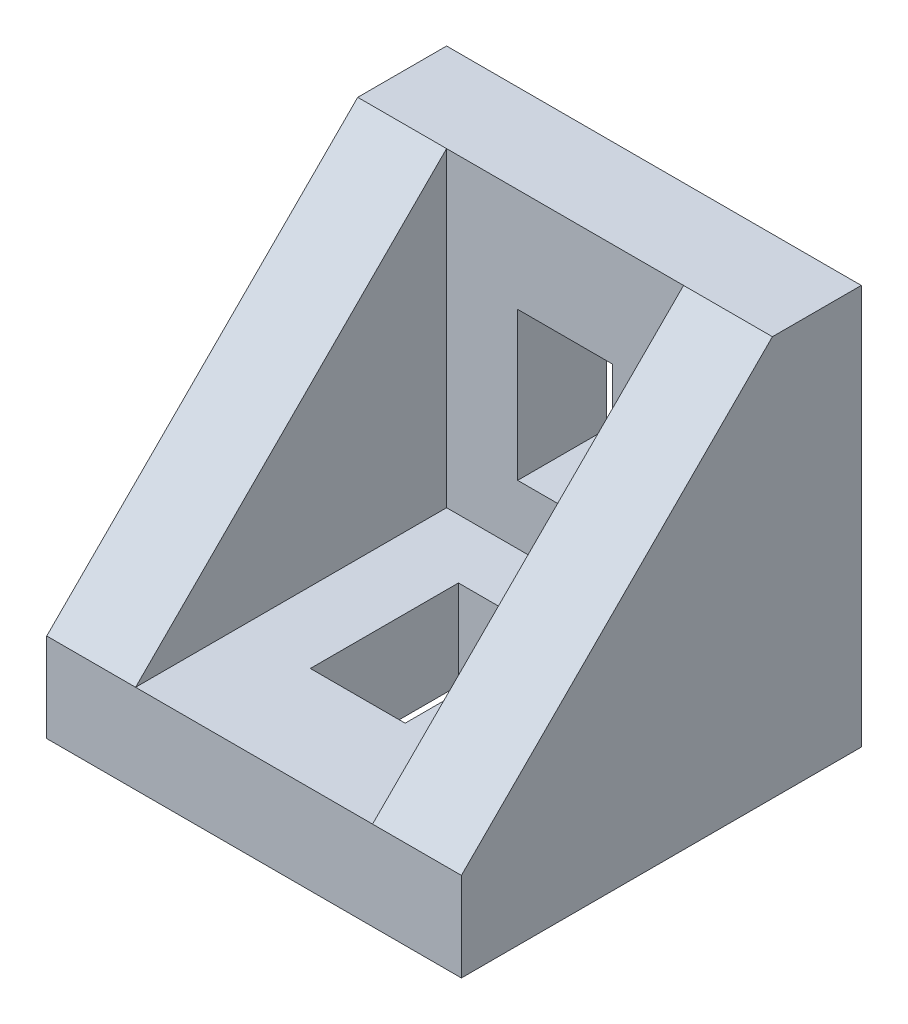
ISO-10303-21;
HEADER;
FILE_DESCRIPTION(('STEP AP214'),'2;1');
FILE_NAME('part.step','',(''),(''),'','','');
FILE_SCHEMA(('AUTOMOTIVE_DESIGN { 1 0 10303 214 1 1 1 1 }'));
ENDSEC;
DATA;
#1=APPLICATION_CONTEXT('core data for automotive mechanical design processes');
#2=APPLICATION_PROTOCOL_DEFINITION('international standard','automotive_design',2000,#1);
#3=PRODUCT_CONTEXT('',#1,'mechanical');
#4=PRODUCT('Part','Part','',(#3));
#5=PRODUCT_RELATED_PRODUCT_CATEGORY('part','',(#4));
#6=PRODUCT_DEFINITION_FORMATION('','',#4);
#7=PRODUCT_DEFINITION_CONTEXT('part definition',#1,'design');
#8=PRODUCT_DEFINITION('design','',#6,#7);
#9=PRODUCT_DEFINITION_SHAPE('','',#8);
#10=(LENGTH_UNIT() NAMED_UNIT(*) SI_UNIT(.MILLI.,.METRE.));
#11=(NAMED_UNIT(*) PLANE_ANGLE_UNIT() SI_UNIT($,.RADIAN.));
#12=(NAMED_UNIT(*) SI_UNIT($,.STERADIAN.) SOLID_ANGLE_UNIT());
#13=UNCERTAINTY_MEASURE_WITH_UNIT(LENGTH_MEASURE(1.E-05),#10,'distance_accuracy_value','');
#14=(GEOMETRIC_REPRESENTATION_CONTEXT(3) GLOBAL_UNCERTAINTY_ASSIGNED_CONTEXT((#13)) GLOBAL_UNIT_ASSIGNED_CONTEXT((#10,
#11,#12)) REPRESENTATION_CONTEXT('',''));
#15=CARTESIAN_POINT('',(0.,0.,0.));
#16=DIRECTION('',(0.,0.,1.));
#17=DIRECTION('',(1.,0.,0.));
#18=AXIS2_PLACEMENT_3D('',#15,#16,#17);
#19=CARTESIAN_POINT('',(28.,3.,3.));
#20=DIRECTION('',(0.,-0.707106781186547,-0.707106781186547));
#21=DIRECTION('',(0.,0.707106781186548,-0.707106781186548));
#22=AXIS2_PLACEMENT_3D('',#19,#20,#21);
#23=PLANE('',#22);
#24=DIRECTION('',(0.,-0.707106781186548,0.707106781186548));
#25=VECTOR('',#24,1.);
#26=CARTESIAN_POINT('',(6.,3.,3.));
#27=LINE('',#26,#25);
#28=CARTESIAN_POINT('',(6.,27.,-21.));
#29=VERTEX_POINT('',#28);
#30=CARTESIAN_POINT('',(6.,5.99999999999999,0.));
#31=VERTEX_POINT('',#30);
#32=EDGE_CURVE('E253',#29,#31,#27,.T.);
#33=ORIENTED_EDGE('',*,*,#32,.F.);
#34=DIRECTION('',(-1.,0.,0.));
#35=VECTOR('',#34,1.);
#36=CARTESIAN_POINT('',(28.,27.,-21.));
#37=LINE('',#36,#35);
#38=CARTESIAN_POINT('',(0.,27.,-21.));
#39=VERTEX_POINT('',#38);
#40=EDGE_CURVE('E58',#29,#39,#37,.T.);
#41=ORIENTED_EDGE('',*,*,#40,.T.);
#42=DIRECTION('',(0.,-0.707106781186548,0.707106781186548));
#43=VECTOR('',#42,1.);
#44=CARTESIAN_POINT('',(0.,3.,3.));
#45=LINE('',#44,#43);
#46=CARTESIAN_POINT('',(0.,5.99999999999999,0.));
#47=VERTEX_POINT('',#46);
#48=EDGE_CURVE('E308',#39,#47,#45,.T.);
#49=ORIENTED_EDGE('',*,*,#48,.T.);
#50=DIRECTION('',(-1.,0.,0.));
#51=VECTOR('',#50,1.);
#52=CARTESIAN_POINT('',(28.,5.99999999999999,0.));
#53=LINE('',#52,#51);
#54=EDGE_CURVE('E330',#31,#47,#53,.T.);
#55=ORIENTED_EDGE('',*,*,#54,.F.);
#56=EDGE_LOOP('',(#33,#41,#49,#55));
#57=FACE_BOUND('',#56,.T.);
#58=ADVANCED_FACE('F49',(#57),#23,.F.);
#59=CARTESIAN_POINT('',(28.,27.,0.));
#60=DIRECTION('',(0.,-1.,0.));
#61=DIRECTION('',(0.,0.,-1.));
#62=AXIS2_PLACEMENT_3D('',#59,#60,#61);
#63=PLANE('',#62);
#64=DIRECTION('',(0.,0.,1.));
#65=VECTOR('',#64,1.);
#66=CARTESIAN_POINT('',(0.,27.,0.));
#67=LINE('',#66,#65);
#68=CARTESIAN_POINT('',(0.,27.,-27.));
#69=VERTEX_POINT('',#68);
#70=EDGE_CURVE('E258',#69,#39,#67,.T.);
#71=ORIENTED_EDGE('',*,*,#70,.T.);
#72=ORIENTED_EDGE('',*,*,#40,.F.);
#73=DIRECTION('',(-1.,0.,0.));
#74=VECTOR('',#73,1.);
#75=CARTESIAN_POINT('',(28.,27.,-21.));
#76=LINE('',#75,#74);
#77=CARTESIAN_POINT('',(22.,27.,-21.));
#78=VERTEX_POINT('',#77);
#79=EDGE_CURVE('E254',#78,#29,#76,.T.);
#80=ORIENTED_EDGE('',*,*,#79,.F.);
#81=CARTESIAN_POINT('',(28.,27.,-21.));
#82=VERTEX_POINT('',#81);
#83=EDGE_CURVE('E11',#82,#78,#37,.T.);
#84=ORIENTED_EDGE('',*,*,#83,.F.);
#85=DIRECTION('',(0.,0.,1.));
#86=VECTOR('',#85,1.);
#87=CARTESIAN_POINT('',(28.,27.,0.));
#88=LINE('',#87,#86);
#89=CARTESIAN_POINT('',(28.,27.,-27.));
#90=VERTEX_POINT('',#89);
#91=EDGE_CURVE('E287',#90,#82,#88,.T.);
#92=ORIENTED_EDGE('',*,*,#91,.F.);
#93=DIRECTION('',(-1.,0.,0.));
#94=VECTOR('',#93,1.);
#95=CARTESIAN_POINT('',(28.,27.,-27.));
#96=LINE('',#95,#94);
#97=EDGE_CURVE('E304',#90,#69,#96,.T.);
#98=ORIENTED_EDGE('',*,*,#97,.T.);
#99=EDGE_LOOP('',(#71,#72,#80,#84,#92,#98));
#100=FACE_BOUND('',#99,.T.);
#101=ADVANCED_FACE('F51',(#100),#63,.F.);
#102=ORIENTED_EDGE('',*,*,#83,.T.);
#103=DIRECTION('',(0.,-0.707106781186548,0.707106781186548));
#104=VECTOR('',#103,1.);
#105=CARTESIAN_POINT('',(22.,3.,3.));
#106=LINE('',#105,#104);
#107=CARTESIAN_POINT('',(22.,5.99999999999999,0.));
#108=VERTEX_POINT('',#107);
#109=EDGE_CURVE('E272',#78,#108,#106,.T.);
#110=ORIENTED_EDGE('',*,*,#109,.T.);
#111=CARTESIAN_POINT('',(28.,5.99999999999999,0.));
#112=VERTEX_POINT('',#111);
#113=EDGE_CURVE('E331',#112,#108,#53,.T.);
#114=ORIENTED_EDGE('',*,*,#113,.F.);
#115=DIRECTION('',(0.,-0.707106781186548,0.707106781186548));
#116=VECTOR('',#115,1.);
#117=CARTESIAN_POINT('',(28.,3.,3.));
#118=LINE('',#117,#116);
#119=EDGE_CURVE('E291',#82,#112,#118,.T.);
#120=ORIENTED_EDGE('',*,*,#119,.F.);
#121=EDGE_LOOP('',(#102,#110,#114,#120));
#122=FACE_BOUND('',#121,.T.);
#123=ADVANCED_FACE('F364',(#122),#23,.F.);
#124=CARTESIAN_POINT('',(28.,0.,0.));
#125=DIRECTION('',(0.,0.,-1.));
#126=DIRECTION('',(-1.,0.,0.));
#127=AXIS2_PLACEMENT_3D('',#124,#125,#126);
#128=PLANE('',#127);
#129=DIRECTION('',(0.,-1.,0.));
#130=VECTOR('',#129,1.);
#131=CARTESIAN_POINT('',(0.,0.,0.));
#132=LINE('',#131,#130);
#133=CARTESIAN_POINT('',(0.,0.,0.));
#134=VERTEX_POINT('',#133);
#135=EDGE_CURVE('E312',#47,#134,#132,.T.);
#136=ORIENTED_EDGE('',*,*,#135,.T.);
#137=DIRECTION('',(-1.,0.,0.));
#138=VECTOR('',#137,1.);
#139=CARTESIAN_POINT('',(28.,0.,0.));
#140=LINE('',#139,#138);
#141=CARTESIAN_POINT('',(28.,0.,0.));
#142=VERTEX_POINT('',#141);
#143=EDGE_CURVE('E327',#142,#134,#140,.T.);
#144=ORIENTED_EDGE('',*,*,#143,.F.);
#145=DIRECTION('',(0.,-1.,0.));
#146=VECTOR('',#145,1.);
#147=CARTESIAN_POINT('',(28.,0.,0.));
#148=LINE('',#147,#146);
#149=EDGE_CURVE('E295',#112,#142,#148,.T.);
#150=ORIENTED_EDGE('',*,*,#149,.F.);
#151=ORIENTED_EDGE('',*,*,#113,.T.);
#152=DIRECTION('',(-1.,0.,0.));
#153=VECTOR('',#152,1.);
#154=CARTESIAN_POINT('',(28.,6.,0.));
#155=LINE('',#154,#153);
#156=EDGE_CURVE('E259',#108,#31,#155,.T.);
#157=ORIENTED_EDGE('',*,*,#156,.T.);
#158=ORIENTED_EDGE('',*,*,#54,.T.);
#159=EDGE_LOOP('',(#136,#144,#150,#151,#157,#158));
#160=FACE_BOUND('',#159,.T.);
#161=ADVANCED_FACE('F340',(#160),#128,.F.);
#162=CARTESIAN_POINT('',(28.,0.,0.));
#163=DIRECTION('',(0.,1.,0.));
#164=DIRECTION('',(0.,0.,1.));
#165=AXIS2_PLACEMENT_3D('',#162,#163,#164);
#166=PLANE('',#165);
#167=DIRECTION('',(1.,0.,0.));
#168=VECTOR('',#167,1.);
#169=CARTESIAN_POINT('',(10.8,0.,-17.));
#170=LINE('',#169,#168);
#171=CARTESIAN_POINT('',(10.8,0.,-17.));
#172=VERTEX_POINT('',#171);
#173=CARTESIAN_POINT('',(17.2,0.,-17.));
#174=VERTEX_POINT('',#173);
#175=EDGE_CURVE('E185',#172,#174,#170,.T.);
#176=ORIENTED_EDGE('',*,*,#175,.F.);
#177=DIRECTION('',(0.,0.,-1.));
#178=VECTOR('',#177,1.);
#179=CARTESIAN_POINT('',(10.8,0.,-17.));
#180=LINE('',#179,#178);
#181=CARTESIAN_POINT('',(10.8,0.,-7.));
#182=VERTEX_POINT('',#181);
#183=EDGE_CURVE('E165',#182,#172,#180,.T.);
#184=ORIENTED_EDGE('',*,*,#183,.F.);
#185=DIRECTION('',(-1.,0.,0.));
#186=VECTOR('',#185,1.);
#187=CARTESIAN_POINT('',(10.8,0.,-7.));
#188=LINE('',#187,#186);
#189=CARTESIAN_POINT('',(17.2,0.,-7.));
#190=VERTEX_POINT('',#189);
#191=EDGE_CURVE('E175',#190,#182,#188,.T.);
#192=ORIENTED_EDGE('',*,*,#191,.F.);
#193=DIRECTION('',(0.,0.,1.));
#194=VECTOR('',#193,1.);
#195=CARTESIAN_POINT('',(17.2,0.,-17.));
#196=LINE('',#195,#194);
#197=EDGE_CURVE('E65',#174,#190,#196,.T.);
#198=ORIENTED_EDGE('',*,*,#197,.F.);
#199=EDGE_LOOP('',(#176,#184,#192,#198));
#200=FACE_BOUND('',#199,.T.);
#201=DIRECTION('',(0.,0.,-1.));
#202=VECTOR('',#201,1.);
#203=CARTESIAN_POINT('',(0.,0.,0.));
#204=LINE('',#203,#202);
#205=CARTESIAN_POINT('',(0.,0.,-27.));
#206=VERTEX_POINT('',#205);
#207=EDGE_CURVE('E315',#134,#206,#204,.T.);
#208=ORIENTED_EDGE('',*,*,#207,.T.);
#209=DIRECTION('',(-1.,0.,0.));
#210=VECTOR('',#209,1.);
#211=CARTESIAN_POINT('',(28.,0.,-27.));
#212=LINE('',#211,#210);
#213=CARTESIAN_POINT('',(28.,0.,-27.));
#214=VERTEX_POINT('',#213);
#215=EDGE_CURVE('E323',#214,#206,#212,.T.);
#216=ORIENTED_EDGE('',*,*,#215,.F.);
#217=DIRECTION('',(0.,0.,-1.));
#218=VECTOR('',#217,1.);
#219=CARTESIAN_POINT('',(28.,0.,0.));
#220=LINE('',#219,#218);
#221=EDGE_CURVE('E298',#142,#214,#220,.T.);
#222=ORIENTED_EDGE('',*,*,#221,.F.);
#223=ORIENTED_EDGE('',*,*,#143,.T.);
#224=EDGE_LOOP('',(#208,#216,#222,#223));
#225=FACE_BOUND('',#224,.T.);
#226=ADVANCED_FACE('F182',(#200,#225),#166,.F.);
#227=CARTESIAN_POINT('',(28.,0.,-27.));
#228=DIRECTION('',(0.,0.,1.));
#229=DIRECTION('',(1.,0.,0.));
#230=AXIS2_PLACEMENT_3D('',#227,#228,#229);
#231=PLANE('',#230);
#232=DIRECTION('',(1.,0.,0.));
#233=VECTOR('',#232,1.);
#234=CARTESIAN_POINT('',(10.8,20.,-27.));
#235=LINE('',#234,#233);
#236=CARTESIAN_POINT('',(10.8,20.,-27.));
#237=VERTEX_POINT('',#236);
#238=CARTESIAN_POINT('',(17.2,20.,-27.));
#239=VERTEX_POINT('',#238);
#240=EDGE_CURVE('E213',#237,#239,#235,.T.);
#241=ORIENTED_EDGE('',*,*,#240,.F.);
#242=DIRECTION('',(0.,1.,0.));
#243=VECTOR('',#242,1.);
#244=CARTESIAN_POINT('',(10.8,20.,-27.));
#245=LINE('',#244,#243);
#246=CARTESIAN_POINT('',(10.8,10.,-27.));
#247=VERTEX_POINT('',#246);
#248=EDGE_CURVE('E217',#247,#237,#245,.T.);
#249=ORIENTED_EDGE('',*,*,#248,.F.);
#250=DIRECTION('',(-1.,0.,0.));
#251=VECTOR('',#250,1.);
#252=CARTESIAN_POINT('',(10.8,10.,-27.));
#253=LINE('',#252,#251);
#254=CARTESIAN_POINT('',(17.2,10.,-27.));
#255=VERTEX_POINT('',#254);
#256=EDGE_CURVE('E240',#255,#247,#253,.T.);
#257=ORIENTED_EDGE('',*,*,#256,.F.);
#258=DIRECTION('',(0.,-1.,0.));
#259=VECTOR('',#258,1.);
#260=CARTESIAN_POINT('',(17.2,20.,-27.));
#261=LINE('',#260,#259);
#262=EDGE_CURVE('E179',#239,#255,#261,.T.);
#263=ORIENTED_EDGE('',*,*,#262,.F.);
#264=EDGE_LOOP('',(#241,#249,#257,#263));
#265=FACE_BOUND('',#264,.T.);
#266=DIRECTION('',(0.,1.,0.));
#267=VECTOR('',#266,1.);
#268=CARTESIAN_POINT('',(0.,0.,-27.));
#269=LINE('',#268,#267);
#270=EDGE_CURVE('E292',#206,#69,#269,.T.);
#271=ORIENTED_EDGE('',*,*,#270,.T.);
#272=ORIENTED_EDGE('',*,*,#97,.F.);
#273=DIRECTION('',(0.,1.,0.));
#274=VECTOR('',#273,1.);
#275=CARTESIAN_POINT('',(28.,0.,-27.));
#276=LINE('',#275,#274);
#277=EDGE_CURVE('E301',#214,#90,#276,.T.);
#278=ORIENTED_EDGE('',*,*,#277,.F.);
#279=ORIENTED_EDGE('',*,*,#215,.T.);
#280=EDGE_LOOP('',(#271,#272,#278,#279));
#281=FACE_BOUND('',#280,.T.);
#282=ADVANCED_FACE('F357',(#265,#281),#231,.F.);
#283=CARTESIAN_POINT('',(28.,0.,0.));
#284=DIRECTION('',(1.,0.,0.));
#285=DIRECTION('',(0.,0.,-1.));
#286=AXIS2_PLACEMENT_3D('',#283,#284,#285);
#287=PLANE('',#286);
#288=ORIENTED_EDGE('',*,*,#91,.T.);
#289=ORIENTED_EDGE('',*,*,#119,.T.);
#290=ORIENTED_EDGE('',*,*,#149,.T.);
#291=ORIENTED_EDGE('',*,*,#221,.T.);
#292=ORIENTED_EDGE('',*,*,#277,.T.);
#293=EDGE_LOOP('',(#288,#289,#290,#291,#292));
#294=FACE_BOUND('',#293,.T.);
#295=ADVANCED_FACE('F361',(#294),#287,.T.);
#296=CARTESIAN_POINT('',(0.,0.,0.));
#297=DIRECTION('',(1.,0.,0.));
#298=DIRECTION('',(0.,0.,-1.));
#299=AXIS2_PLACEMENT_3D('',#296,#297,#298);
#300=PLANE('',#299);
#301=ORIENTED_EDGE('',*,*,#70,.F.);
#302=ORIENTED_EDGE('',*,*,#270,.F.);
#303=ORIENTED_EDGE('',*,*,#207,.F.);
#304=ORIENTED_EDGE('',*,*,#135,.F.);
#305=ORIENTED_EDGE('',*,*,#48,.F.);
#306=EDGE_LOOP('',(#301,#302,#303,#304,#305));
#307=FACE_BOUND('',#306,.T.);
#308=ADVANCED_FACE('F351',(#307),#300,.F.);
#309=CARTESIAN_POINT('',(28.,6.,0.));
#310=DIRECTION('',(0.,1.,0.));
#311=DIRECTION('',(0.,0.,1.));
#312=AXIS2_PLACEMENT_3D('',#309,#310,#311);
#313=PLANE('',#312);
#314=DIRECTION('',(0.,0.,1.));
#315=VECTOR('',#314,1.);
#316=CARTESIAN_POINT('',(10.8,6.,-17.));
#317=LINE('',#316,#315);
#318=CARTESIAN_POINT('',(10.8,6.,-17.));
#319=VERTEX_POINT('',#318);
#320=CARTESIAN_POINT('',(10.8,6.,-7.));
#321=VERTEX_POINT('',#320);
#322=EDGE_CURVE('E73',#319,#321,#317,.T.);
#323=ORIENTED_EDGE('',*,*,#322,.F.);
#324=DIRECTION('',(-1.,0.,0.));
#325=VECTOR('',#324,1.);
#326=CARTESIAN_POINT('',(10.8,6.,-17.));
#327=LINE('',#326,#325);
#328=CARTESIAN_POINT('',(17.2,6.,-17.));
#329=VERTEX_POINT('',#328);
#330=EDGE_CURVE('E172',#329,#319,#327,.T.);
#331=ORIENTED_EDGE('',*,*,#330,.F.);
#332=DIRECTION('',(0.,0.,-1.));
#333=VECTOR('',#332,1.);
#334=CARTESIAN_POINT('',(17.2,6.,-17.));
#335=LINE('',#334,#333);
#336=CARTESIAN_POINT('',(17.2,6.,-7.));
#337=VERTEX_POINT('',#336);
#338=EDGE_CURVE('E197',#337,#329,#335,.T.);
#339=ORIENTED_EDGE('',*,*,#338,.F.);
#340=DIRECTION('',(1.,0.,0.));
#341=VECTOR('',#340,1.);
#342=CARTESIAN_POINT('',(10.8,6.,-7.));
#343=LINE('',#342,#341);
#344=EDGE_CURVE('E190',#321,#337,#343,.T.);
#345=ORIENTED_EDGE('',*,*,#344,.F.);
#346=EDGE_LOOP('',(#323,#331,#339,#345));
#347=FACE_BOUND('',#346,.T.);
#348=DIRECTION('',(0.,0.,-1.));
#349=VECTOR('',#348,1.);
#350=CARTESIAN_POINT('',(6.,6.,0.));
#351=LINE('',#350,#349);
#352=CARTESIAN_POINT('',(6.,6.,-21.));
#353=VERTEX_POINT('',#352);
#354=EDGE_CURVE('E260',#31,#353,#351,.T.);
#355=ORIENTED_EDGE('',*,*,#354,.F.);
#356=ORIENTED_EDGE('',*,*,#156,.F.);
#357=DIRECTION('',(0.,0.,-1.));
#358=VECTOR('',#357,1.);
#359=CARTESIAN_POINT('',(22.,6.,0.));
#360=LINE('',#359,#358);
#361=CARTESIAN_POINT('',(22.,6.,-21.));
#362=VERTEX_POINT('',#361);
#363=EDGE_CURVE('E269',#108,#362,#360,.T.);
#364=ORIENTED_EDGE('',*,*,#363,.T.);
#365=DIRECTION('',(-1.,0.,0.));
#366=VECTOR('',#365,1.);
#367=CARTESIAN_POINT('',(28.,6.,-21.));
#368=LINE('',#367,#366);
#369=EDGE_CURVE('E264',#362,#353,#368,.T.);
#370=ORIENTED_EDGE('',*,*,#369,.T.);
#371=EDGE_LOOP('',(#355,#356,#364,#370));
#372=FACE_BOUND('',#371,.T.);
#373=ADVANCED_FACE('F391',(#347,#372),#313,.T.);
#374=CARTESIAN_POINT('',(28.,0.,-21.));
#375=DIRECTION('',(0.,0.,1.));
#376=DIRECTION('',(1.,0.,0.));
#377=AXIS2_PLACEMENT_3D('',#374,#375,#376);
#378=PLANE('',#377);
#379=DIRECTION('',(0.,-1.,0.));
#380=VECTOR('',#379,1.);
#381=CARTESIAN_POINT('',(10.8,20.,-21.));
#382=LINE('',#381,#380);
#383=CARTESIAN_POINT('',(10.8,20.,-21.));
#384=VERTEX_POINT('',#383);
#385=CARTESIAN_POINT('',(10.8,10.,-21.));
#386=VERTEX_POINT('',#385);
#387=EDGE_CURVE('E221',#384,#386,#382,.T.);
#388=ORIENTED_EDGE('',*,*,#387,.F.);
#389=DIRECTION('',(-1.,0.,0.));
#390=VECTOR('',#389,1.);
#391=CARTESIAN_POINT('',(10.8,20.,-21.));
#392=LINE('',#391,#390);
#393=CARTESIAN_POINT('',(17.2,20.,-21.));
#394=VERTEX_POINT('',#393);
#395=EDGE_CURVE('E232',#394,#384,#392,.T.);
#396=ORIENTED_EDGE('',*,*,#395,.F.);
#397=DIRECTION('',(0.,1.,0.));
#398=VECTOR('',#397,1.);
#399=CARTESIAN_POINT('',(17.2,20.,-21.));
#400=LINE('',#399,#398);
#401=CARTESIAN_POINT('',(17.2,10.,-21.));
#402=VERTEX_POINT('',#401);
#403=EDGE_CURVE('E228',#402,#394,#400,.T.);
#404=ORIENTED_EDGE('',*,*,#403,.F.);
#405=DIRECTION('',(1.,0.,0.));
#406=VECTOR('',#405,1.);
#407=CARTESIAN_POINT('',(10.8,10.,-21.));
#408=LINE('',#407,#406);
#409=EDGE_CURVE('E224',#386,#402,#408,.T.);
#410=ORIENTED_EDGE('',*,*,#409,.F.);
#411=EDGE_LOOP('',(#388,#396,#404,#410));
#412=FACE_BOUND('',#411,.T.);
#413=DIRECTION('',(0.,1.,0.));
#414=VECTOR('',#413,1.);
#415=CARTESIAN_POINT('',(6.,0.,-21.));
#416=LINE('',#415,#414);
#417=EDGE_CURVE('E263',#353,#29,#416,.T.);
#418=ORIENTED_EDGE('',*,*,#417,.F.);
#419=ORIENTED_EDGE('',*,*,#369,.F.);
#420=DIRECTION('',(0.,1.,0.));
#421=VECTOR('',#420,1.);
#422=CARTESIAN_POINT('',(22.,0.,-21.));
#423=LINE('',#422,#421);
#424=EDGE_CURVE('E268',#362,#78,#423,.T.);
#425=ORIENTED_EDGE('',*,*,#424,.T.);
#426=ORIENTED_EDGE('',*,*,#79,.T.);
#427=EDGE_LOOP('',(#418,#419,#425,#426));
#428=FACE_BOUND('',#427,.T.);
#429=ADVANCED_FACE('F372',(#412,#428),#378,.T.);
#430=CARTESIAN_POINT('',(22.,0.,0.));
#431=DIRECTION('',(1.,0.,0.));
#432=DIRECTION('',(0.,0.,-1.));
#433=AXIS2_PLACEMENT_3D('',#430,#431,#432);
#434=PLANE('',#433);
#435=ORIENTED_EDGE('',*,*,#424,.F.);
#436=ORIENTED_EDGE('',*,*,#363,.F.);
#437=ORIENTED_EDGE('',*,*,#109,.F.);
#438=EDGE_LOOP('',(#435,#436,#437));
#439=FACE_BOUND('',#438,.T.);
#440=ADVANCED_FACE('F367',(#439),#434,.F.);
#441=CARTESIAN_POINT('',(6.,0.,0.));
#442=DIRECTION('',(1.,0.,0.));
#443=DIRECTION('',(0.,0.,-1.));
#444=AXIS2_PLACEMENT_3D('',#441,#442,#443);
#445=PLANE('',#444);
#446=ORIENTED_EDGE('',*,*,#32,.T.);
#447=ORIENTED_EDGE('',*,*,#354,.T.);
#448=ORIENTED_EDGE('',*,*,#417,.T.);
#449=EDGE_LOOP('',(#446,#447,#448));
#450=FACE_BOUND('',#449,.T.);
#451=ADVANCED_FACE('F394',(#450),#445,.T.);
#452=CARTESIAN_POINT('',(10.8,20.,-27.001));
#453=DIRECTION('',(-1.,0.,0.));
#454=DIRECTION('',(0.,0.,1.));
#455=AXIS2_PLACEMENT_3D('',#452,#453,#454);
#456=PLANE('',#455);
#457=ORIENTED_EDGE('',*,*,#248,.T.);
#458=DIRECTION('',(0.,0.,1.));
#459=VECTOR('',#458,1.);
#460=CARTESIAN_POINT('',(10.8,20.,-27.001));
#461=LINE('',#460,#459);
#462=EDGE_CURVE('E237',#237,#384,#461,.T.);
#463=ORIENTED_EDGE('',*,*,#462,.T.);
#464=ORIENTED_EDGE('',*,*,#387,.T.);
#465=DIRECTION('',(0.,0.,1.));
#466=VECTOR('',#465,1.);
#467=CARTESIAN_POINT('',(10.8,10.,-27.001));
#468=LINE('',#467,#466);
#469=EDGE_CURVE('E236',#247,#386,#468,.T.);
#470=ORIENTED_EDGE('',*,*,#469,.F.);
#471=EDGE_LOOP('',(#457,#463,#464,#470));
#472=FACE_BOUND('',#471,.T.);
#473=ADVANCED_FACE('F397',(#472),#456,.F.);
#474=CARTESIAN_POINT('',(10.8,20.,-27.001));
#475=DIRECTION('',(0.,1.,0.));
#476=DIRECTION('',(0.,0.,1.));
#477=AXIS2_PLACEMENT_3D('',#474,#475,#476);
#478=PLANE('',#477);
#479=ORIENTED_EDGE('',*,*,#240,.T.);
#480=DIRECTION('',(0.,0.,1.));
#481=VECTOR('',#480,1.);
#482=CARTESIAN_POINT('',(17.2,20.,-27.001));
#483=LINE('',#482,#481);
#484=EDGE_CURVE('E241',#239,#394,#483,.T.);
#485=ORIENTED_EDGE('',*,*,#484,.T.);
#486=ORIENTED_EDGE('',*,*,#395,.T.);
#487=ORIENTED_EDGE('',*,*,#462,.F.);
#488=EDGE_LOOP('',(#479,#485,#486,#487));
#489=FACE_BOUND('',#488,.T.);
#490=ADVANCED_FACE('F409',(#489),#478,.F.);
#491=CARTESIAN_POINT('',(17.2,20.,-27.001));
#492=DIRECTION('',(1.,0.,0.));
#493=DIRECTION('',(0.,0.,-1.));
#494=AXIS2_PLACEMENT_3D('',#491,#492,#493);
#495=PLANE('',#494);
#496=ORIENTED_EDGE('',*,*,#262,.T.);
#497=DIRECTION('',(0.,0.,1.));
#498=VECTOR('',#497,1.);
#499=CARTESIAN_POINT('',(17.2,10.,-27.001));
#500=LINE('',#499,#498);
#501=EDGE_CURVE('E244',#255,#402,#500,.T.);
#502=ORIENTED_EDGE('',*,*,#501,.T.);
#503=ORIENTED_EDGE('',*,*,#403,.T.);
#504=ORIENTED_EDGE('',*,*,#484,.F.);
#505=EDGE_LOOP('',(#496,#502,#503,#504));
#506=FACE_BOUND('',#505,.T.);
#507=ADVANCED_FACE('F414',(#506),#495,.F.);
#508=CARTESIAN_POINT('',(10.8,10.,-27.001));
#509=DIRECTION('',(0.,-1.,0.));
#510=DIRECTION('',(0.,0.,-1.));
#511=AXIS2_PLACEMENT_3D('',#508,#509,#510);
#512=PLANE('',#511);
#513=ORIENTED_EDGE('',*,*,#256,.T.);
#514=ORIENTED_EDGE('',*,*,#469,.T.);
#515=ORIENTED_EDGE('',*,*,#409,.T.);
#516=ORIENTED_EDGE('',*,*,#501,.F.);
#517=EDGE_LOOP('',(#513,#514,#515,#516));
#518=FACE_BOUND('',#517,.T.);
#519=ADVANCED_FACE('F411',(#518),#512,.F.);
#520=CARTESIAN_POINT('',(10.8,-0.00100000000000013,-17.));
#521=DIRECTION('',(-1.,0.,0.));
#522=DIRECTION('',(0.,0.,1.));
#523=AXIS2_PLACEMENT_3D('',#520,#521,#522);
#524=PLANE('',#523);
#525=ORIENTED_EDGE('',*,*,#183,.T.);
#526=DIRECTION('',(0.,1.,0.));
#527=VECTOR('',#526,1.);
#528=CARTESIAN_POINT('',(10.8,-0.00100000000000013,-17.));
#529=LINE('',#528,#527);
#530=EDGE_CURVE('E180',#172,#319,#529,.T.);
#531=ORIENTED_EDGE('',*,*,#530,.T.);
#532=ORIENTED_EDGE('',*,*,#322,.T.);
#533=DIRECTION('',(0.,1.,0.));
#534=VECTOR('',#533,1.);
#535=CARTESIAN_POINT('',(10.8,-0.00100000000000013,-7.));
#536=LINE('',#535,#534);
#537=EDGE_CURVE('E161',#182,#321,#536,.T.);
#538=ORIENTED_EDGE('',*,*,#537,.F.);
#539=EDGE_LOOP('',(#525,#531,#532,#538));
#540=FACE_BOUND('',#539,.T.);
#541=ADVANCED_FACE('F163',(#540),#524,.F.);
#542=CARTESIAN_POINT('',(10.8,-0.00100000000000013,-17.));
#543=DIRECTION('',(0.,0.,-1.));
#544=DIRECTION('',(-1.,0.,0.));
#545=AXIS2_PLACEMENT_3D('',#542,#543,#544);
#546=PLANE('',#545);
#547=ORIENTED_EDGE('',*,*,#175,.T.);
#548=DIRECTION('',(0.,1.,0.));
#549=VECTOR('',#548,1.);
#550=CARTESIAN_POINT('',(17.2,-0.00100000000000013,-17.));
#551=LINE('',#550,#549);
#552=EDGE_CURVE('E206',#174,#329,#551,.T.);
#553=ORIENTED_EDGE('',*,*,#552,.T.);
#554=ORIENTED_EDGE('',*,*,#330,.T.);
#555=ORIENTED_EDGE('',*,*,#530,.F.);
#556=EDGE_LOOP('',(#547,#553,#554,#555));
#557=FACE_BOUND('',#556,.T.);
#558=ADVANCED_FACE('F424',(#557),#546,.F.);
#559=CARTESIAN_POINT('',(17.2,-0.00100000000000013,-17.));
#560=DIRECTION('',(1.,0.,0.));
#561=DIRECTION('',(0.,0.,-1.));
#562=AXIS2_PLACEMENT_3D('',#559,#560,#561);
#563=PLANE('',#562);
#564=ORIENTED_EDGE('',*,*,#197,.T.);
#565=DIRECTION('',(0.,1.,0.));
#566=VECTOR('',#565,1.);
#567=CARTESIAN_POINT('',(17.2,-0.00100000000000013,-7.));
#568=LINE('',#567,#566);
#569=EDGE_CURVE('E171',#190,#337,#568,.T.);
#570=ORIENTED_EDGE('',*,*,#569,.T.);
#571=ORIENTED_EDGE('',*,*,#338,.T.);
#572=ORIENTED_EDGE('',*,*,#552,.F.);
#573=EDGE_LOOP('',(#564,#570,#571,#572));
#574=FACE_BOUND('',#573,.T.);
#575=ADVANCED_FACE('F427',(#574),#563,.F.);
#576=CARTESIAN_POINT('',(10.8,-0.00100000000000013,-7.));
#577=DIRECTION('',(0.,0.,1.));
#578=DIRECTION('',(1.,0.,0.));
#579=AXIS2_PLACEMENT_3D('',#576,#577,#578);
#580=PLANE('',#579);
#581=ORIENTED_EDGE('',*,*,#191,.T.);
#582=ORIENTED_EDGE('',*,*,#537,.T.);
#583=ORIENTED_EDGE('',*,*,#344,.T.);
#584=ORIENTED_EDGE('',*,*,#569,.F.);
#585=EDGE_LOOP('',(#581,#582,#583,#584));
#586=FACE_BOUND('',#585,.T.);
#587=ADVANCED_FACE('F176',(#586),#580,.F.);
#588=CLOSED_SHELL('',(#58,#101,#123,#161,#226,#282,#295,#308,#373,#429,#440,#451,#473,#490,#507,
#519,#541,#558,#575,#587));
#589=MANIFOLD_SOLID_BREP('B2',#588);
#590=ADVANCED_BREP_SHAPE_REPRESENTATION('',(#18,#589),#14);
#591=SHAPE_DEFINITION_REPRESENTATION(#9,#590);
ENDSEC;
END-ISO-10303-21;
